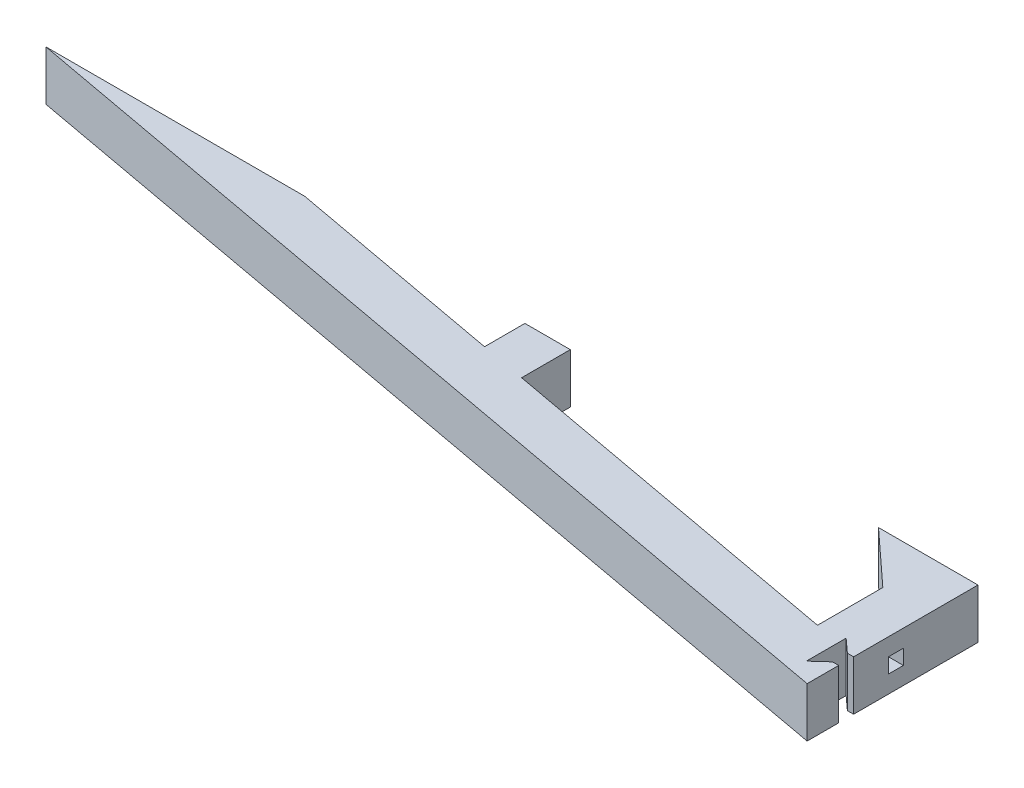
ISO-10303-21;
HEADER;
FILE_DESCRIPTION(('STEP AP214'),'2;1');
FILE_NAME('part.step','',(''),(''),'','','');
FILE_SCHEMA(('AUTOMOTIVE_DESIGN { 1 0 10303 214 1 1 1 1 }'));
ENDSEC;
DATA;
#1=APPLICATION_CONTEXT('core data for automotive mechanical design processes');
#2=APPLICATION_PROTOCOL_DEFINITION('international standard','automotive_design',2000,#1);
#3=PRODUCT_CONTEXT('',#1,'mechanical');
#4=PRODUCT('Part','Part','',(#3));
#5=PRODUCT_RELATED_PRODUCT_CATEGORY('part','',(#4));
#6=PRODUCT_DEFINITION_FORMATION('','',#4);
#7=PRODUCT_DEFINITION_CONTEXT('part definition',#1,'design');
#8=PRODUCT_DEFINITION('design','',#6,#7);
#9=PRODUCT_DEFINITION_SHAPE('','',#8);
#10=(LENGTH_UNIT() NAMED_UNIT(*) SI_UNIT(.MILLI.,.METRE.));
#11=(NAMED_UNIT(*) PLANE_ANGLE_UNIT() SI_UNIT($,.RADIAN.));
#12=(NAMED_UNIT(*) SI_UNIT($,.STERADIAN.) SOLID_ANGLE_UNIT());
#13=UNCERTAINTY_MEASURE_WITH_UNIT(LENGTH_MEASURE(1.E-05),#10,'distance_accuracy_value','');
#14=(GEOMETRIC_REPRESENTATION_CONTEXT(3) GLOBAL_UNCERTAINTY_ASSIGNED_CONTEXT((#13)) GLOBAL_UNIT_ASSIGNED_CONTEXT((#10,
#11,#12)) REPRESENTATION_CONTEXT('',''));
#15=CARTESIAN_POINT('',(0.,0.,0.));
#16=DIRECTION('',(0.,0.,1.));
#17=DIRECTION('',(1.,0.,0.));
#18=AXIS2_PLACEMENT_3D('',#15,#16,#17);
#19=CARTESIAN_POINT('',(0.,8.,0.));
#20=DIRECTION('',(-1.,0.,0.));
#21=DIRECTION('',(0.,0.,1.));
#22=AXIS2_PLACEMENT_3D('',#19,#20,#21);
#23=PLANE('',#22);
#24=DIRECTION('',(0.,0.,-1.));
#25=VECTOR('',#24,1.);
#26=CARTESIAN_POINT('',(0.,0.,0.));
#27=LINE('',#26,#25);
#28=CARTESIAN_POINT('',(0.,0.,27.47211487));
#29=VERTEX_POINT('',#28);
#30=CARTESIAN_POINT('',(0.,0.,22.4));
#31=VERTEX_POINT('',#30);
#32=EDGE_CURVE('E273',#29,#31,#27,.T.);
#33=ORIENTED_EDGE('',*,*,#32,.T.);
#34=DIRECTION('',(0.,1.,0.));
#35=VECTOR('',#34,1.);
#36=CARTESIAN_POINT('',(0.,0.,22.4));
#37=LINE('',#36,#35);
#38=CARTESIAN_POINT('',(0.,8.,22.4));
#39=VERTEX_POINT('',#38);
#40=EDGE_CURVE('E256',#31,#39,#37,.T.);
#41=ORIENTED_EDGE('',*,*,#40,.T.);
#42=DIRECTION('',(0.,0.,-1.));
#43=VECTOR('',#42,1.);
#44=CARTESIAN_POINT('',(0.,8.,0.));
#45=LINE('',#44,#43);
#46=CARTESIAN_POINT('',(0.,8.,27.47211487));
#47=VERTEX_POINT('',#46);
#48=EDGE_CURVE('E290',#47,#39,#45,.T.);
#49=ORIENTED_EDGE('',*,*,#48,.F.);
#50=DIRECTION('',(0.,-1.,0.));
#51=VECTOR('',#50,1.);
#52=CARTESIAN_POINT('',(0.,8.,27.47211487));
#53=LINE('',#52,#51);
#54=EDGE_CURVE('E317',#47,#29,#53,.T.);
#55=ORIENTED_EDGE('',*,*,#54,.T.);
#56=EDGE_LOOP('',(#33,#41,#49,#55));
#57=FACE_BOUND('',#56,.T.);
#58=ADVANCED_FACE('F32',(#57),#23,.F.);
#59=CARTESIAN_POINT('',(-7.3,8.,0.));
#60=DIRECTION('',(0.,0.,1.));
#61=DIRECTION('',(1.,0.,0.));
#62=AXIS2_PLACEMENT_3D('',#59,#60,#61);
#63=PLANE('',#62);
#64=CARTESIAN_POINT('',(-3.65,4.,0.));
#65=DIRECTION('',(0.,0.,-1.));
#66=DIRECTION('',(-1.,0.,0.));
#67=AXIS2_PLACEMENT_3D('',#64,#65,#66);
#68=CIRCLE('',#67,2.2);
#69=CARTESIAN_POINT('',(-5.85,4.,0.));
#70=VERTEX_POINT('',#69);
#71=EDGE_CURVE('E642',#70,#70,#68,.T.);
#72=ORIENTED_EDGE('',*,*,#71,.F.);
#73=EDGE_LOOP('',(#72));
#74=FACE_BOUND('',#73,.T.);
#75=DIRECTION('',(-1.,0.,0.));
#76=VECTOR('',#75,1.);
#77=CARTESIAN_POINT('',(-7.3,0.,0.));
#78=LINE('',#77,#76);
#79=CARTESIAN_POINT('',(0.,0.,0.));
#80=VERTEX_POINT('',#79);
#81=CARTESIAN_POINT('',(-16.,0.,0.));
#82=VERTEX_POINT('',#81);
#83=EDGE_CURVE('E259',#80,#82,#78,.T.);
#84=ORIENTED_EDGE('',*,*,#83,.T.);
#85=DIRECTION('',(0.,1.,0.));
#86=VECTOR('',#85,1.);
#87=CARTESIAN_POINT('',(-16.,0.,0.));
#88=LINE('',#87,#86);
#89=CARTESIAN_POINT('',(-16.,8.,0.));
#90=VERTEX_POINT('',#89);
#91=EDGE_CURVE('E221',#82,#90,#88,.T.);
#92=ORIENTED_EDGE('',*,*,#91,.T.);
#93=DIRECTION('',(-1.,0.,0.));
#94=VECTOR('',#93,1.);
#95=CARTESIAN_POINT('',(-7.3,8.,0.));
#96=LINE('',#95,#94);
#97=CARTESIAN_POINT('',(0.,8.,0.));
#98=VERTEX_POINT('',#97);
#99=EDGE_CURVE('E269',#98,#90,#96,.T.);
#100=ORIENTED_EDGE('',*,*,#99,.F.);
#101=DIRECTION('',(0.,-1.,0.));
#102=VECTOR('',#101,1.);
#103=CARTESIAN_POINT('',(0.,8.,0.));
#104=LINE('',#103,#102);
#105=EDGE_CURVE('E293',#98,#80,#104,.T.);
#106=ORIENTED_EDGE('',*,*,#105,.T.);
#107=EDGE_LOOP('',(#84,#92,#100,#106));
#108=FACE_BOUND('',#107,.T.);
#109=ADVANCED_FACE('F34',(#74,#108),#63,.F.);
#110=CARTESIAN_POINT('',(-7.3,8.,18.5087593431004));
#111=DIRECTION('',(1.,0.,0.));
#112=DIRECTION('',(0.,0.,-1.));
#113=AXIS2_PLACEMENT_3D('',#110,#111,#112);
#114=PLANE('',#113);
#115=DIRECTION('',(0.,0.,1.));
#116=VECTOR('',#115,1.);
#117=CARTESIAN_POINT('',(-7.3,8.,18.5087593431004));
#118=LINE('',#117,#116);
#119=CARTESIAN_POINT('',(-7.3,8.,8.));
#120=VERTEX_POINT('',#119);
#121=CARTESIAN_POINT('',(-7.3,8.,18.5087593431004));
#122=VERTEX_POINT('',#121);
#123=EDGE_CURVE('E272',#120,#122,#118,.T.);
#124=ORIENTED_EDGE('',*,*,#123,.F.);
#125=DIRECTION('',(0.,-1.,0.));
#126=VECTOR('',#125,1.);
#127=CARTESIAN_POINT('',(-7.3,8.,8.));
#128=LINE('',#127,#126);
#129=CARTESIAN_POINT('',(-7.3,0.,8.));
#130=VERTEX_POINT('',#129);
#131=EDGE_CURVE('E225',#120,#130,#128,.T.);
#132=ORIENTED_EDGE('',*,*,#131,.T.);
#133=DIRECTION('',(0.,0.,1.));
#134=VECTOR('',#133,1.);
#135=CARTESIAN_POINT('',(-7.3,0.,18.5087593431004));
#136=LINE('',#135,#134);
#137=CARTESIAN_POINT('',(-7.3,0.,18.5087593431004));
#138=VERTEX_POINT('',#137);
#139=EDGE_CURVE('E296',#130,#138,#136,.T.);
#140=ORIENTED_EDGE('',*,*,#139,.T.);
#141=DIRECTION('',(0.,-1.,0.));
#142=VECTOR('',#141,1.);
#143=CARTESIAN_POINT('',(-7.3,8.,18.5087593431004));
#144=LINE('',#143,#142);
#145=EDGE_CURVE('E11',#122,#138,#144,.T.);
#146=ORIENTED_EDGE('',*,*,#145,.F.);
#147=EDGE_LOOP('',(#124,#132,#140,#146));
#148=FACE_BOUND('',#147,.T.);
#149=ADVANCED_FACE('F367',(#148),#114,.F.);
#150=CARTESIAN_POINT('',(-65.55,8.,7.82944326528233));
#151=DIRECTION('',(-0.180330309758334,0.,0.983606109874508));
#152=DIRECTION('',(0.983606109874508,0.,0.180330309758334));
#153=AXIS2_PLACEMENT_3D('',#150,#151,#152);
#154=PLANE('',#153);
#155=DIRECTION('',(-0.983606109874508,0.,-0.180330309758334));
#156=VECTOR('',#155,1.);
#157=CARTESIAN_POINT('',(-65.55,0.,7.82944326528233));
#158=LINE('',#157,#156);
#159=CARTESIAN_POINT('',(-65.55,0.,7.82944326528233));
#160=VERTEX_POINT('',#159);
#161=EDGE_CURVE('E298',#138,#160,#158,.T.);
#162=ORIENTED_EDGE('',*,*,#161,.T.);
#163=DIRECTION('',(0.,-1.,0.));
#164=VECTOR('',#163,1.);
#165=CARTESIAN_POINT('',(-65.55,8.,7.82944326528233));
#166=LINE('',#165,#164);
#167=CARTESIAN_POINT('',(-65.55,8.,7.82944326528233));
#168=VERTEX_POINT('',#167);
#169=EDGE_CURVE('E40',#168,#160,#166,.T.);
#170=ORIENTED_EDGE('',*,*,#169,.F.);
#171=DIRECTION('',(-0.983606109874508,0.,-0.180330309758334));
#172=VECTOR('',#171,1.);
#173=CARTESIAN_POINT('',(-65.55,8.,7.82944326528233));
#174=LINE('',#173,#172);
#175=EDGE_CURVE('E275',#122,#168,#174,.T.);
#176=ORIENTED_EDGE('',*,*,#175,.F.);
#177=ORIENTED_EDGE('',*,*,#145,.T.);
#178=EDGE_LOOP('',(#162,#170,#176,#177));
#179=FACE_BOUND('',#178,.T.);
#180=ADVANCED_FACE('F365',(#179),#154,.F.);
#181=CARTESIAN_POINT('',(-65.55,8.,7.82944326528233));
#182=DIRECTION('',(-1.,0.,0.));
#183=DIRECTION('',(0.,0.,1.));
#184=AXIS2_PLACEMENT_3D('',#181,#182,#183);
#185=PLANE('',#184);
#186=DIRECTION('',(0.,0.,-1.));
#187=VECTOR('',#186,1.);
#188=CARTESIAN_POINT('',(-65.55,0.,7.82944326528233));
#189=LINE('',#188,#187);
#190=CARTESIAN_POINT('',(-65.55,0.,0.));
#191=VERTEX_POINT('',#190);
#192=EDGE_CURVE('E300',#160,#191,#189,.T.);
#193=ORIENTED_EDGE('',*,*,#192,.T.);
#194=DIRECTION('',(0.,-1.,0.));
#195=VECTOR('',#194,1.);
#196=CARTESIAN_POINT('',(-65.55,8.,0.));
#197=LINE('',#196,#195);
#198=CARTESIAN_POINT('',(-65.55,8.,0.));
#199=VERTEX_POINT('',#198);
#200=EDGE_CURVE('E332',#199,#191,#197,.T.);
#201=ORIENTED_EDGE('',*,*,#200,.F.);
#202=DIRECTION('',(0.,0.,-1.));
#203=VECTOR('',#202,1.);
#204=CARTESIAN_POINT('',(-65.55,8.,7.82944326528233));
#205=LINE('',#204,#203);
#206=EDGE_CURVE('E277',#168,#199,#205,.T.);
#207=ORIENTED_EDGE('',*,*,#206,.F.);
#208=ORIENTED_EDGE('',*,*,#169,.T.);
#209=EDGE_LOOP('',(#193,#201,#207,#208));
#210=FACE_BOUND('',#209,.T.);
#211=ADVANCED_FACE('F339',(#210),#185,.F.);
#212=CARTESIAN_POINT('',(-65.55,8.,0.));
#213=DIRECTION('',(0.,0.,1.));
#214=DIRECTION('',(1.,0.,0.));
#215=AXIS2_PLACEMENT_3D('',#212,#213,#214);
#216=PLANE('',#215);
#217=CARTESIAN_POINT('',(-69.2,4.,0.));
#218=DIRECTION('',(0.,0.,-1.));
#219=DIRECTION('',(-1.,0.,0.));
#220=AXIS2_PLACEMENT_3D('',#217,#218,#219);
#221=CIRCLE('',#220,2.2);
#222=CARTESIAN_POINT('',(-71.4,4.,0.));
#223=VERTEX_POINT('',#222);
#224=EDGE_CURVE('E201',#223,#223,#221,.T.);
#225=ORIENTED_EDGE('',*,*,#224,.F.);
#226=EDGE_LOOP('',(#225));
#227=FACE_BOUND('',#226,.T.);
#228=DIRECTION('',(-1.,0.,0.));
#229=VECTOR('',#228,1.);
#230=CARTESIAN_POINT('',(-65.55,0.,0.));
#231=LINE('',#230,#229);
#232=CARTESIAN_POINT('',(-72.85,0.,0.));
#233=VERTEX_POINT('',#232);
#234=EDGE_CURVE('E302',#191,#233,#231,.T.);
#235=ORIENTED_EDGE('',*,*,#234,.T.);
#236=DIRECTION('',(0.,-1.,0.));
#237=VECTOR('',#236,1.);
#238=CARTESIAN_POINT('',(-72.85,8.,0.));
#239=LINE('',#238,#237);
#240=CARTESIAN_POINT('',(-72.85,8.,0.));
#241=VERTEX_POINT('',#240);
#242=EDGE_CURVE('E329',#241,#233,#239,.T.);
#243=ORIENTED_EDGE('',*,*,#242,.F.);
#244=DIRECTION('',(-1.,0.,0.));
#245=VECTOR('',#244,1.);
#246=CARTESIAN_POINT('',(-65.55,8.,0.));
#247=LINE('',#246,#245);
#248=EDGE_CURVE('E279',#199,#241,#247,.T.);
#249=ORIENTED_EDGE('',*,*,#248,.F.);
#250=ORIENTED_EDGE('',*,*,#200,.T.);
#251=EDGE_LOOP('',(#235,#243,#249,#250));
#252=FACE_BOUND('',#251,.T.);
#253=ADVANCED_FACE('F353',(#227,#252),#216,.F.);
#254=CARTESIAN_POINT('',(-72.85,8.,0.));
#255=DIRECTION('',(1.,0.,0.));
#256=DIRECTION('',(0.,0.,-1.));
#257=AXIS2_PLACEMENT_3D('',#254,#255,#256);
#258=PLANE('',#257);
#259=DIRECTION('',(0.,0.,1.));
#260=VECTOR('',#259,1.);
#261=CARTESIAN_POINT('',(-72.85,0.,0.));
#262=LINE('',#261,#260);
#263=CARTESIAN_POINT('',(-72.85,0.,6.49109120746135));
#264=VERTEX_POINT('',#263);
#265=EDGE_CURVE('E304',#233,#264,#262,.T.);
#266=ORIENTED_EDGE('',*,*,#265,.T.);
#267=DIRECTION('',(0.,-1.,0.));
#268=VECTOR('',#267,1.);
#269=CARTESIAN_POINT('',(-72.85,8.,6.49109120746135));
#270=LINE('',#269,#268);
#271=CARTESIAN_POINT('',(-72.85,8.,6.49109120746135));
#272=VERTEX_POINT('',#271);
#273=EDGE_CURVE('E326',#272,#264,#270,.T.);
#274=ORIENTED_EDGE('',*,*,#273,.F.);
#275=DIRECTION('',(0.,0.,1.));
#276=VECTOR('',#275,1.);
#277=CARTESIAN_POINT('',(-72.85,8.,0.));
#278=LINE('',#277,#276);
#279=EDGE_CURVE('E281',#241,#272,#278,.T.);
#280=ORIENTED_EDGE('',*,*,#279,.F.);
#281=ORIENTED_EDGE('',*,*,#242,.T.);
#282=EDGE_LOOP('',(#266,#274,#280,#281));
#283=FACE_BOUND('',#282,.T.);
#284=ADVANCED_FACE('F357',(#283),#258,.F.);
#285=CARTESIAN_POINT('',(-72.85,8.,6.49109120746135));
#286=DIRECTION('',(-0.180330309758334,0.,0.983606109874508));
#287=DIRECTION('',(0.983606109874508,0.,0.180330309758334));
#288=AXIS2_PLACEMENT_3D('',#285,#286,#287);
#289=PLANE('',#288);
#290=DIRECTION('',(-0.983606109874508,0.,-0.180330309758334));
#291=VECTOR('',#290,1.);
#292=CARTESIAN_POINT('',(-72.85,0.,6.49109120746135));
#293=LINE('',#292,#291);
#294=CARTESIAN_POINT('',(-108.259653873212,0.,-0.000769494996487487));
#295=VERTEX_POINT('',#294);
#296=EDGE_CURVE('E306',#264,#295,#293,.T.);
#297=ORIENTED_EDGE('',*,*,#296,.T.);
#298=DIRECTION('',(0.,-1.,0.));
#299=VECTOR('',#298,1.);
#300=CARTESIAN_POINT('',(-108.259653873212,8.,-0.000769494996487487));
#301=LINE('',#300,#299);
#302=CARTESIAN_POINT('',(-108.259653873212,8.,-0.000769494996487487));
#303=VERTEX_POINT('',#302);
#304=EDGE_CURVE('E323',#303,#295,#301,.T.);
#305=ORIENTED_EDGE('',*,*,#304,.F.);
#306=DIRECTION('',(-0.983606109874508,0.,-0.180330309758334));
#307=VECTOR('',#306,1.);
#308=CARTESIAN_POINT('',(-72.85,8.,6.49109120746135));
#309=LINE('',#308,#307);
#310=EDGE_CURVE('E283',#272,#303,#309,.T.);
#311=ORIENTED_EDGE('',*,*,#310,.F.);
#312=ORIENTED_EDGE('',*,*,#273,.T.);
#313=EDGE_LOOP('',(#297,#305,#311,#312));
#314=FACE_BOUND('',#313,.T.);
#315=ADVANCED_FACE('F409',(#314),#289,.F.);
#316=CARTESIAN_POINT('',(-108.259653873212,8.,-0.000769494996487487));
#317=DIRECTION('',(0.,0.,1.));
#318=DIRECTION('',(1.,0.,0.));
#319=AXIS2_PLACEMENT_3D('',#316,#317,#318);
#320=PLANE('',#319);
#321=DIRECTION('',(-1.,0.,0.));
#322=VECTOR('',#321,1.);
#323=CARTESIAN_POINT('',(-108.259653873212,0.,-0.000769494996487487));
#324=LINE('',#323,#322);
#325=CARTESIAN_POINT('',(-149.85,0.,-0.000769494996482462));
#326=VERTEX_POINT('',#325);
#327=EDGE_CURVE('E308',#295,#326,#324,.T.);
#328=ORIENTED_EDGE('',*,*,#327,.T.);
#329=DIRECTION('',(0.,-1.,0.));
#330=VECTOR('',#329,1.);
#331=CARTESIAN_POINT('',(-149.85,8.,-0.000769494996482462));
#332=LINE('',#331,#330);
#333=CARTESIAN_POINT('',(-149.85,8.,-0.000769494996482462));
#334=VERTEX_POINT('',#333);
#335=EDGE_CURVE('E320',#334,#326,#332,.T.);
#336=ORIENTED_EDGE('',*,*,#335,.F.);
#337=DIRECTION('',(-1.,0.,0.));
#338=VECTOR('',#337,1.);
#339=CARTESIAN_POINT('',(-108.259653873212,8.,-0.000769494996487487));
#340=LINE('',#339,#338);
#341=EDGE_CURVE('E285',#303,#334,#340,.T.);
#342=ORIENTED_EDGE('',*,*,#341,.F.);
#343=ORIENTED_EDGE('',*,*,#304,.T.);
#344=EDGE_LOOP('',(#328,#336,#342,#343));
#345=FACE_BOUND('',#344,.T.);
#346=ADVANCED_FACE('F407',(#345),#320,.F.);
#347=CARTESIAN_POINT('',(0.,8.,27.47211487));
#348=DIRECTION('',(0.180330309758334,0.,-0.983606109874508));
#349=DIRECTION('',(-0.983606109874508,0.,-0.180330309758334));
#350=AXIS2_PLACEMENT_3D('',#347,#348,#349);
#351=PLANE('',#350);
#352=DIRECTION('',(0.983606109874508,0.,0.180330309758334));
#353=VECTOR('',#352,1.);
#354=CARTESIAN_POINT('',(0.,0.,27.47211487));
#355=LINE('',#354,#353);
#356=EDGE_CURVE('E310',#326,#29,#355,.T.);
#357=ORIENTED_EDGE('',*,*,#356,.T.);
#358=ORIENTED_EDGE('',*,*,#54,.F.);
#359=DIRECTION('',(0.983606109874508,0.,0.180330309758334));
#360=VECTOR('',#359,1.);
#361=CARTESIAN_POINT('',(0.,8.,27.47211487));
#362=LINE('',#361,#360);
#363=EDGE_CURVE('E287',#334,#47,#362,.T.);
#364=ORIENTED_EDGE('',*,*,#363,.F.);
#365=ORIENTED_EDGE('',*,*,#335,.T.);
#366=EDGE_LOOP('',(#357,#358,#364,#365));
#367=FACE_BOUND('',#366,.T.);
#368=ADVANCED_FACE('F403',(#367),#351,.F.);
#369=DIRECTION('',(0.,0.,-1.));
#370=VECTOR('',#369,1.);
#371=CARTESIAN_POINT('',(0.,2.8,14.4));
#372=LINE('',#371,#370);
#373=CARTESIAN_POINT('',(0.,2.8,14.4));
#374=VERTEX_POINT('',#373);
#375=CARTESIAN_POINT('',(0.,2.8,12.));
#376=VERTEX_POINT('',#375);
#377=EDGE_CURVE('E207',#374,#376,#372,.T.);
#378=ORIENTED_EDGE('',*,*,#377,.F.);
#379=DIRECTION('',(0.,-1.,0.));
#380=VECTOR('',#379,1.);
#381=CARTESIAN_POINT('',(0.,5.2,14.4));
#382=LINE('',#381,#380);
#383=CARTESIAN_POINT('',(0.,5.2,14.4));
#384=VERTEX_POINT('',#383);
#385=EDGE_CURVE('E47',#384,#374,#382,.T.);
#386=ORIENTED_EDGE('',*,*,#385,.F.);
#387=DIRECTION('',(0.,0.,1.));
#388=VECTOR('',#387,1.);
#389=CARTESIAN_POINT('',(0.,5.2,14.4));
#390=LINE('',#389,#388);
#391=CARTESIAN_POINT('',(0.,5.2,12.));
#392=VERTEX_POINT('',#391);
#393=EDGE_CURVE('E195',#392,#384,#390,.T.);
#394=ORIENTED_EDGE('',*,*,#393,.F.);
#395=DIRECTION('',(0.,1.,0.));
#396=VECTOR('',#395,1.);
#397=CARTESIAN_POINT('',(0.,5.2,12.));
#398=LINE('',#397,#396);
#399=EDGE_CURVE('E198',#376,#392,#398,.T.);
#400=ORIENTED_EDGE('',*,*,#399,.F.);
#401=EDGE_LOOP('',(#378,#386,#394,#400));
#402=FACE_BOUND('',#401,.T.);
#403=CARTESIAN_POINT('',(0.,0.,20.));
#404=VERTEX_POINT('',#403);
#405=EDGE_CURVE('E312',#404,#80,#27,.T.);
#406=ORIENTED_EDGE('',*,*,#405,.T.);
#407=ORIENTED_EDGE('',*,*,#105,.F.);
#408=CARTESIAN_POINT('',(0.,8.,20.));
#409=VERTEX_POINT('',#408);
#410=EDGE_CURVE('E289',#409,#98,#45,.T.);
#411=ORIENTED_EDGE('',*,*,#410,.F.);
#412=DIRECTION('',(0.,1.,0.));
#413=VECTOR('',#412,1.);
#414=CARTESIAN_POINT('',(0.,0.,20.));
#415=LINE('',#414,#413);
#416=EDGE_CURVE('E243',#404,#409,#415,.T.);
#417=ORIENTED_EDGE('',*,*,#416,.F.);
#418=EDGE_LOOP('',(#406,#407,#411,#417));
#419=FACE_BOUND('',#418,.T.);
#420=ADVANCED_FACE('F376',(#402,#419),#23,.F.);
#421=CARTESIAN_POINT('',(0.,8.,0.));
#422=DIRECTION('',(0.,-1.,0.));
#423=DIRECTION('',(0.,0.,-1.));
#424=AXIS2_PLACEMENT_3D('',#421,#422,#423);
#425=PLANE('',#424);
#426=ORIENTED_EDGE('',*,*,#99,.T.);
#427=DIRECTION('',(0.736099620693866,0.,0.676873214431141));
#428=VECTOR('',#427,1.);
#429=CARTESIAN_POINT('',(-16.,8.,0.));
#430=LINE('',#429,#428);
#431=EDGE_CURVE('E218',#90,#120,#430,.T.);
#432=ORIENTED_EDGE('',*,*,#431,.T.);
#433=ORIENTED_EDGE('',*,*,#123,.T.);
#434=ORIENTED_EDGE('',*,*,#175,.T.);
#435=ORIENTED_EDGE('',*,*,#206,.T.);
#436=ORIENTED_EDGE('',*,*,#248,.T.);
#437=ORIENTED_EDGE('',*,*,#279,.T.);
#438=ORIENTED_EDGE('',*,*,#310,.T.);
#439=ORIENTED_EDGE('',*,*,#341,.T.);
#440=ORIENTED_EDGE('',*,*,#363,.T.);
#441=ORIENTED_EDGE('',*,*,#48,.T.);
#442=DIRECTION('',(1.,0.,0.));
#443=VECTOR('',#442,1.);
#444=CARTESIAN_POINT('',(-0.999999999999996,8.,22.4));
#445=LINE('',#444,#443);
#446=CARTESIAN_POINT('',(-0.999999999999996,8.,22.4));
#447=VERTEX_POINT('',#446);
#448=EDGE_CURVE('E232',#447,#39,#445,.T.);
#449=ORIENTED_EDGE('',*,*,#448,.F.);
#450=DIRECTION('',(0.739940073395943,0.,-0.672672793996313));
#451=VECTOR('',#450,1.);
#452=CARTESIAN_POINT('',(-3.2,8.,24.4));
#453=LINE('',#452,#451);
#454=CARTESIAN_POINT('',(-3.2,8.,24.4));
#455=VERTEX_POINT('',#454);
#456=EDGE_CURVE('E252',#455,#447,#453,.T.);
#457=ORIENTED_EDGE('',*,*,#456,.F.);
#458=DIRECTION('',(0.,0.,1.));
#459=VECTOR('',#458,1.);
#460=CARTESIAN_POINT('',(-3.2,8.,18.));
#461=LINE('',#460,#459);
#462=CARTESIAN_POINT('',(-3.2,8.,18.));
#463=VERTEX_POINT('',#462);
#464=EDGE_CURVE('E249',#463,#455,#461,.T.);
#465=ORIENTED_EDGE('',*,*,#464,.F.);
#466=DIRECTION('',(-0.739940073395941,0.,-0.672672793996315));
#467=VECTOR('',#466,1.);
#468=CARTESIAN_POINT('',(-1.00000000000001,8.,20.));
#469=LINE('',#468,#467);
#470=CARTESIAN_POINT('',(-1.00000000000001,8.,20.));
#471=VERTEX_POINT('',#470);
#472=EDGE_CURVE('E246',#471,#463,#469,.T.);
#473=ORIENTED_EDGE('',*,*,#472,.F.);
#474=DIRECTION('',(-1.,0.,0.));
#475=VECTOR('',#474,1.);
#476=CARTESIAN_POINT('',(0.,8.,20.));
#477=LINE('',#476,#475);
#478=EDGE_CURVE('E228',#409,#471,#477,.T.);
#479=ORIENTED_EDGE('',*,*,#478,.F.);
#480=ORIENTED_EDGE('',*,*,#410,.T.);
#481=EDGE_LOOP('',(#426,#432,#433,#434,#435,#436,#437,#438,#439,#440,#441,#449,#457,#465,#473,
#479,#480));
#482=FACE_BOUND('',#481,.T.);
#483=ADVANCED_FACE('F361',(#482),#425,.F.);
#484=CARTESIAN_POINT('',(0.,0.,0.));
#485=DIRECTION('',(0.,-1.,0.));
#486=DIRECTION('',(0.,0.,-1.));
#487=AXIS2_PLACEMENT_3D('',#484,#485,#486);
#488=PLANE('',#487);
#489=DIRECTION('',(0.736099620693866,0.,0.676873214431141));
#490=VECTOR('',#489,1.);
#491=CARTESIAN_POINT('',(-16.,0.,0.));
#492=LINE('',#491,#490);
#493=EDGE_CURVE('E214',#82,#130,#492,.T.);
#494=ORIENTED_EDGE('',*,*,#493,.F.);
#495=ORIENTED_EDGE('',*,*,#83,.F.);
#496=ORIENTED_EDGE('',*,*,#405,.F.);
#497=DIRECTION('',(-1.,0.,0.));
#498=VECTOR('',#497,1.);
#499=CARTESIAN_POINT('',(0.,0.,20.));
#500=LINE('',#499,#498);
#501=CARTESIAN_POINT('',(-1.00000000000001,0.,20.));
#502=VERTEX_POINT('',#501);
#503=EDGE_CURVE('E229',#404,#502,#500,.T.);
#504=ORIENTED_EDGE('',*,*,#503,.T.);
#505=DIRECTION('',(-0.739940073395941,0.,-0.672672793996315));
#506=VECTOR('',#505,1.);
#507=CARTESIAN_POINT('',(-1.00000000000001,0.,20.));
#508=LINE('',#507,#506);
#509=CARTESIAN_POINT('',(-3.2,0.,18.));
#510=VERTEX_POINT('',#509);
#511=EDGE_CURVE('E55',#502,#510,#508,.T.);
#512=ORIENTED_EDGE('',*,*,#511,.T.);
#513=DIRECTION('',(0.,0.,1.));
#514=VECTOR('',#513,1.);
#515=CARTESIAN_POINT('',(-3.2,0.,18.));
#516=LINE('',#515,#514);
#517=CARTESIAN_POINT('',(-3.2,0.,24.4));
#518=VERTEX_POINT('',#517);
#519=EDGE_CURVE('E234',#510,#518,#516,.T.);
#520=ORIENTED_EDGE('',*,*,#519,.T.);
#521=DIRECTION('',(0.739940073395943,0.,-0.672672793996313));
#522=VECTOR('',#521,1.);
#523=CARTESIAN_POINT('',(-3.2,0.,24.4));
#524=LINE('',#523,#522);
#525=CARTESIAN_POINT('',(-0.999999999999996,0.,22.4));
#526=VERTEX_POINT('',#525);
#527=EDGE_CURVE('E237',#518,#526,#524,.T.);
#528=ORIENTED_EDGE('',*,*,#527,.T.);
#529=DIRECTION('',(1.,0.,0.));
#530=VECTOR('',#529,1.);
#531=CARTESIAN_POINT('',(-0.999999999999996,0.,22.4));
#532=LINE('',#531,#530);
#533=EDGE_CURVE('E240',#526,#31,#532,.T.);
#534=ORIENTED_EDGE('',*,*,#533,.T.);
#535=ORIENTED_EDGE('',*,*,#32,.F.);
#536=ORIENTED_EDGE('',*,*,#356,.F.);
#537=ORIENTED_EDGE('',*,*,#327,.F.);
#538=ORIENTED_EDGE('',*,*,#296,.F.);
#539=ORIENTED_EDGE('',*,*,#265,.F.);
#540=ORIENTED_EDGE('',*,*,#234,.F.);
#541=ORIENTED_EDGE('',*,*,#192,.F.);
#542=ORIENTED_EDGE('',*,*,#161,.F.);
#543=ORIENTED_EDGE('',*,*,#139,.F.);
#544=EDGE_LOOP('',(#494,#495,#496,#504,#512,#520,#528,#534,#535,#536,#537,#538,#539,#540,#541,
#542,#543));
#545=FACE_BOUND('',#544,.T.);
#546=ADVANCED_FACE('F347',(#545),#488,.T.);
#547=CARTESIAN_POINT('',(-0.999999999999996,0.,22.4));
#548=DIRECTION('',(0.,0.,1.));
#549=DIRECTION('',(1.,0.,0.));
#550=AXIS2_PLACEMENT_3D('',#547,#548,#549);
#551=PLANE('',#550);
#552=ORIENTED_EDGE('',*,*,#448,.T.);
#553=ORIENTED_EDGE('',*,*,#40,.F.);
#554=ORIENTED_EDGE('',*,*,#533,.F.);
#555=DIRECTION('',(0.,1.,0.));
#556=VECTOR('',#555,1.);
#557=CARTESIAN_POINT('',(-0.999999999999996,0.,22.4));
#558=LINE('',#557,#556);
#559=EDGE_CURVE('E260',#526,#447,#558,.T.);
#560=ORIENTED_EDGE('',*,*,#559,.T.);
#561=EDGE_LOOP('',(#552,#553,#554,#560));
#562=FACE_BOUND('',#561,.T.);
#563=ADVANCED_FACE('F395',(#562),#551,.F.);
#564=CARTESIAN_POINT('',(-3.2,0.,24.4));
#565=DIRECTION('',(0.672672793996313,0.,0.739940073395943));
#566=DIRECTION('',(0.739940073395943,0.,-0.672672793996313));
#567=AXIS2_PLACEMENT_3D('',#564,#565,#566);
#568=PLANE('',#567);
#569=ORIENTED_EDGE('',*,*,#456,.T.);
#570=ORIENTED_EDGE('',*,*,#559,.F.);
#571=ORIENTED_EDGE('',*,*,#527,.F.);
#572=DIRECTION('',(0.,1.,0.));
#573=VECTOR('',#572,1.);
#574=CARTESIAN_POINT('',(-3.2,0.,24.4));
#575=LINE('',#574,#573);
#576=EDGE_CURVE('E262',#518,#455,#575,.T.);
#577=ORIENTED_EDGE('',*,*,#576,.T.);
#578=EDGE_LOOP('',(#569,#570,#571,#577));
#579=FACE_BOUND('',#578,.T.);
#580=ADVANCED_FACE('F393',(#579),#568,.F.);
#581=CARTESIAN_POINT('',(-3.2,0.,18.));
#582=DIRECTION('',(-1.,0.,0.));
#583=DIRECTION('',(0.,0.,1.));
#584=AXIS2_PLACEMENT_3D('',#581,#582,#583);
#585=PLANE('',#584);
#586=ORIENTED_EDGE('',*,*,#464,.T.);
#587=ORIENTED_EDGE('',*,*,#576,.F.);
#588=ORIENTED_EDGE('',*,*,#519,.F.);
#589=DIRECTION('',(0.,1.,0.));
#590=VECTOR('',#589,1.);
#591=CARTESIAN_POINT('',(-3.2,0.,18.));
#592=LINE('',#591,#590);
#593=EDGE_CURVE('E264',#510,#463,#592,.T.);
#594=ORIENTED_EDGE('',*,*,#593,.T.);
#595=EDGE_LOOP('',(#586,#587,#588,#594));
#596=FACE_BOUND('',#595,.T.);
#597=ADVANCED_FACE('F388',(#596),#585,.F.);
#598=CARTESIAN_POINT('',(-1.00000000000001,0.,20.));
#599=DIRECTION('',(0.672672793996316,0.,-0.739940073395941));
#600=DIRECTION('',(-0.739940073395941,0.,-0.672672793996315));
#601=AXIS2_PLACEMENT_3D('',#598,#599,#600);
#602=PLANE('',#601);
#603=ORIENTED_EDGE('',*,*,#472,.T.);
#604=ORIENTED_EDGE('',*,*,#593,.F.);
#605=ORIENTED_EDGE('',*,*,#511,.F.);
#606=DIRECTION('',(0.,1.,0.));
#607=VECTOR('',#606,1.);
#608=CARTESIAN_POINT('',(-1.00000000000001,0.,20.));
#609=LINE('',#608,#607);
#610=EDGE_CURVE('E266',#502,#471,#609,.T.);
#611=ORIENTED_EDGE('',*,*,#610,.T.);
#612=EDGE_LOOP('',(#603,#604,#605,#611));
#613=FACE_BOUND('',#612,.T.);
#614=ADVANCED_FACE('F382',(#613),#602,.F.);
#615=CARTESIAN_POINT('',(0.,0.,20.));
#616=DIRECTION('',(0.,0.,-1.));
#617=DIRECTION('',(-1.,0.,0.));
#618=AXIS2_PLACEMENT_3D('',#615,#616,#617);
#619=PLANE('',#618);
#620=ORIENTED_EDGE('',*,*,#478,.T.);
#621=ORIENTED_EDGE('',*,*,#610,.F.);
#622=ORIENTED_EDGE('',*,*,#503,.F.);
#623=ORIENTED_EDGE('',*,*,#416,.T.);
#624=EDGE_LOOP('',(#620,#621,#622,#623));
#625=FACE_BOUND('',#624,.T.);
#626=ADVANCED_FACE('F379',(#625),#619,.F.);
#627=CARTESIAN_POINT('',(-16.,8.,0.));
#628=DIRECTION('',(0.676873214431141,0.,-0.736099620693866));
#629=DIRECTION('',(-0.736099620693866,0.,-0.676873214431141));
#630=AXIS2_PLACEMENT_3D('',#627,#628,#629);
#631=PLANE('',#630);
#632=ORIENTED_EDGE('',*,*,#493,.T.);
#633=ORIENTED_EDGE('',*,*,#131,.F.);
#634=ORIENTED_EDGE('',*,*,#431,.F.);
#635=ORIENTED_EDGE('',*,*,#91,.F.);
#636=EDGE_LOOP('',(#632,#633,#634,#635));
#637=FACE_BOUND('',#636,.T.);
#638=ADVANCED_FACE('F446',(#637),#631,.F.);
#639=CARTESIAN_POINT('',(-4.4,5.2,14.4));
#640=DIRECTION('',(0.,0.,1.));
#641=DIRECTION('',(1.,0.,0.));
#642=AXIS2_PLACEMENT_3D('',#639,#640,#641);
#643=PLANE('',#642);
#644=ORIENTED_EDGE('',*,*,#385,.T.);
#645=DIRECTION('',(1.,0.,0.));
#646=VECTOR('',#645,1.);
#647=CARTESIAN_POINT('',(-4.4,2.8,14.4));
#648=LINE('',#647,#646);
#649=CARTESIAN_POINT('',(-4.4,2.8,14.4));
#650=VERTEX_POINT('',#649);
#651=EDGE_CURVE('E173',#650,#374,#648,.T.);
#652=ORIENTED_EDGE('',*,*,#651,.F.);
#653=DIRECTION('',(0.,-1.,0.));
#654=VECTOR('',#653,1.);
#655=CARTESIAN_POINT('',(-4.4,5.2,14.4));
#656=LINE('',#655,#654);
#657=CARTESIAN_POINT('',(-4.4,5.2,14.4));
#658=VERTEX_POINT('',#657);
#659=EDGE_CURVE('E177',#658,#650,#656,.T.);
#660=ORIENTED_EDGE('',*,*,#659,.F.);
#661=DIRECTION('',(1.,0.,0.));
#662=VECTOR('',#661,1.);
#663=CARTESIAN_POINT('',(-4.4,5.2,14.4));
#664=LINE('',#663,#662);
#665=EDGE_CURVE('E212',#658,#384,#664,.T.);
#666=ORIENTED_EDGE('',*,*,#665,.T.);
#667=EDGE_LOOP('',(#644,#652,#660,#666));
#668=FACE_BOUND('',#667,.T.);
#669=ADVANCED_FACE('F175',(#668),#643,.F.);
#670=CARTESIAN_POINT('',(-4.4,5.2,14.4));
#671=DIRECTION('',(0.,1.,0.));
#672=DIRECTION('',(0.,0.,1.));
#673=AXIS2_PLACEMENT_3D('',#670,#671,#672);
#674=PLANE('',#673);
#675=ORIENTED_EDGE('',*,*,#393,.T.);
#676=ORIENTED_EDGE('',*,*,#665,.F.);
#677=DIRECTION('',(0.,0.,1.));
#678=VECTOR('',#677,1.);
#679=CARTESIAN_POINT('',(-4.4,5.2,14.4));
#680=LINE('',#679,#678);
#681=CARTESIAN_POINT('',(-4.4,5.2,12.));
#682=VERTEX_POINT('',#681);
#683=EDGE_CURVE('E183',#682,#658,#680,.T.);
#684=ORIENTED_EDGE('',*,*,#683,.F.);
#685=DIRECTION('',(1.,0.,0.));
#686=VECTOR('',#685,1.);
#687=CARTESIAN_POINT('',(-4.4,5.2,12.));
#688=LINE('',#687,#686);
#689=EDGE_CURVE('E215',#682,#392,#688,.T.);
#690=ORIENTED_EDGE('',*,*,#689,.T.);
#691=EDGE_LOOP('',(#675,#676,#684,#690));
#692=FACE_BOUND('',#691,.T.);
#693=ADVANCED_FACE('F438',(#692),#674,.F.);
#694=CARTESIAN_POINT('',(-4.4,5.2,12.));
#695=DIRECTION('',(0.,0.,-1.));
#696=DIRECTION('',(-1.,0.,0.));
#697=AXIS2_PLACEMENT_3D('',#694,#695,#696);
#698=PLANE('',#697);
#699=ORIENTED_EDGE('',*,*,#399,.T.);
#700=ORIENTED_EDGE('',*,*,#689,.F.);
#701=DIRECTION('',(0.,1.,0.));
#702=VECTOR('',#701,1.);
#703=CARTESIAN_POINT('',(-4.4,5.2,12.));
#704=LINE('',#703,#702);
#705=CARTESIAN_POINT('',(-4.4,2.8,12.));
#706=VERTEX_POINT('',#705);
#707=EDGE_CURVE('E191',#706,#682,#704,.T.);
#708=ORIENTED_EDGE('',*,*,#707,.F.);
#709=DIRECTION('',(1.,0.,0.));
#710=VECTOR('',#709,1.);
#711=CARTESIAN_POINT('',(-4.4,2.8,12.));
#712=LINE('',#711,#710);
#713=EDGE_CURVE('E182',#706,#376,#712,.T.);
#714=ORIENTED_EDGE('',*,*,#713,.T.);
#715=EDGE_LOOP('',(#699,#700,#708,#714));
#716=FACE_BOUND('',#715,.T.);
#717=ADVANCED_FACE('F436',(#716),#698,.F.);
#718=CARTESIAN_POINT('',(-4.4,2.8,14.4));
#719=DIRECTION('',(0.,-1.,0.));
#720=DIRECTION('',(0.,0.,-1.));
#721=AXIS2_PLACEMENT_3D('',#718,#719,#720);
#722=PLANE('',#721);
#723=ORIENTED_EDGE('',*,*,#377,.T.);
#724=ORIENTED_EDGE('',*,*,#713,.F.);
#725=DIRECTION('',(0.,0.,-1.));
#726=VECTOR('',#725,1.);
#727=CARTESIAN_POINT('',(-4.4,2.8,14.4));
#728=LINE('',#727,#726);
#729=EDGE_CURVE('E186',#650,#706,#728,.T.);
#730=ORIENTED_EDGE('',*,*,#729,.F.);
#731=ORIENTED_EDGE('',*,*,#651,.T.);
#732=EDGE_LOOP('',(#723,#724,#730,#731));
#733=FACE_BOUND('',#732,.T.);
#734=ADVANCED_FACE('F187',(#733),#722,.F.);
#735=CARTESIAN_POINT('',(-4.4,0.,0.));
#736=DIRECTION('',(1.,0.,0.));
#737=DIRECTION('',(0.,0.,-1.));
#738=AXIS2_PLACEMENT_3D('',#735,#736,#737);
#739=PLANE('',#738);
#740=ORIENTED_EDGE('',*,*,#659,.T.);
#741=ORIENTED_EDGE('',*,*,#729,.T.);
#742=ORIENTED_EDGE('',*,*,#707,.T.);
#743=ORIENTED_EDGE('',*,*,#683,.T.);
#744=EDGE_LOOP('',(#740,#741,#742,#743));
#745=FACE_BOUND('',#744,.T.);
#746=ADVANCED_FACE('F193',(#745),#739,.T.);
#747=CARTESIAN_POINT('',(-69.2,4.,2.40000000000001));
#748=DIRECTION('',(0.,0.,-1.));
#749=DIRECTION('',(-1.,0.,0.));
#750=AXIS2_PLACEMENT_3D('',#747,#748,#749);
#751=CYLINDRICAL_SURFACE('',#750,2.2);
#752=CARTESIAN_POINT('',(-69.2,4.,2.40000000000001));
#753=DIRECTION('',(0.,0.,-1.));
#754=DIRECTION('',(-1.,0.,0.));
#755=AXIS2_PLACEMENT_3D('',#752,#753,#754);
#756=CIRCLE('',#755,2.2);
#757=CARTESIAN_POINT('',(-71.4,4.,2.40000000000001));
#758=VERTEX_POINT('',#757);
#759=EDGE_CURVE('E644',#758,#758,#756,.T.);
#760=ORIENTED_EDGE('',*,*,#759,.F.);
#761=EDGE_LOOP('',(#760));
#762=FACE_BOUND('',#761,.T.);
#763=ORIENTED_EDGE('',*,*,#224,.T.);
#764=EDGE_LOOP('',(#763));
#765=FACE_BOUND('',#764,.T.);
#766=ADVANCED_FACE('F525',(#762,#765),#751,.F.);
#767=CARTESIAN_POINT('',(-69.2,4.,2.40000000000001));
#768=DIRECTION('',(0.,0.,-1.));
#769=DIRECTION('',(-1.,0.,0.));
#770=AXIS2_PLACEMENT_3D('',#767,#768,#769);
#771=PLANE('',#770);
#772=CARTESIAN_POINT('',(-69.2,4.,2.40000000000001));
#773=DIRECTION('',(0.,0.,-1.));
#774=DIRECTION('',(-1.,0.,0.));
#775=AXIS2_PLACEMENT_3D('',#772,#773,#774);
#776=CIRCLE('',#775,1.85);
#777=CARTESIAN_POINT('',(-71.05,4.,2.40000000000001));
#778=VERTEX_POINT('',#777);
#779=EDGE_CURVE('E631',#778,#778,#776,.T.);
#780=ORIENTED_EDGE('',*,*,#779,.F.);
#781=EDGE_LOOP('',(#780));
#782=FACE_BOUND('',#781,.T.);
#783=ORIENTED_EDGE('',*,*,#759,.T.);
#784=EDGE_LOOP('',(#783));
#785=FACE_BOUND('',#784,.T.);
#786=ADVANCED_FACE('F554',(#782,#785),#771,.T.);
#787=CARTESIAN_POINT('',(-3.65,4.,2.4));
#788=DIRECTION('',(0.,0.,-1.));
#789=DIRECTION('',(-1.,0.,0.));
#790=AXIS2_PLACEMENT_3D('',#787,#788,#789);
#791=CYLINDRICAL_SURFACE('',#790,2.2);
#792=CARTESIAN_POINT('',(-3.65,4.,2.4));
#793=DIRECTION('',(0.,0.,-1.));
#794=DIRECTION('',(-1.,0.,0.));
#795=AXIS2_PLACEMENT_3D('',#792,#793,#794);
#796=CIRCLE('',#795,2.2);
#797=CARTESIAN_POINT('',(-5.85,4.,2.4));
#798=VERTEX_POINT('',#797);
#799=EDGE_CURVE('E208',#798,#798,#796,.T.);
#800=ORIENTED_EDGE('',*,*,#799,.F.);
#801=EDGE_LOOP('',(#800));
#802=FACE_BOUND('',#801,.T.);
#803=ORIENTED_EDGE('',*,*,#71,.T.);
#804=EDGE_LOOP('',(#803));
#805=FACE_BOUND('',#804,.T.);
#806=ADVANCED_FACE('F561',(#802,#805),#791,.F.);
#807=CARTESIAN_POINT('',(-3.65,4.,2.4));
#808=DIRECTION('',(0.,0.,-1.));
#809=DIRECTION('',(-1.,0.,0.));
#810=AXIS2_PLACEMENT_3D('',#807,#808,#809);
#811=PLANE('',#810);
#812=CARTESIAN_POINT('',(-3.65,4.,2.4));
#813=DIRECTION('',(0.,0.,-1.));
#814=DIRECTION('',(-1.,0.,0.));
#815=AXIS2_PLACEMENT_3D('',#812,#813,#814);
#816=CIRCLE('',#815,1.85);
#817=CARTESIAN_POINT('',(-5.5,4.,2.4));
#818=VERTEX_POINT('',#817);
#819=EDGE_CURVE('E630',#818,#818,#816,.T.);
#820=ORIENTED_EDGE('',*,*,#819,.F.);
#821=EDGE_LOOP('',(#820));
#822=FACE_BOUND('',#821,.T.);
#823=ORIENTED_EDGE('',*,*,#799,.T.);
#824=EDGE_LOOP('',(#823));
#825=FACE_BOUND('',#824,.T.);
#826=ADVANCED_FACE('F566',(#822,#825),#811,.T.);
#827=CARTESIAN_POINT('',(-3.65,4.,9.4));
#828=DIRECTION('',(0.,0.,-1.));
#829=DIRECTION('',(-1.,0.,0.));
#830=AXIS2_PLACEMENT_3D('',#827,#828,#829);
#831=CYLINDRICAL_SURFACE('',#830,1.85);
#832=CARTESIAN_POINT('',(-3.65,4.,9.4));
#833=DIRECTION('',(0.,0.,-1.));
#834=DIRECTION('',(-1.,0.,0.));
#835=AXIS2_PLACEMENT_3D('',#832,#833,#834);
#836=CIRCLE('',#835,1.85);
#837=CARTESIAN_POINT('',(-5.5,4.,9.4));
#838=VERTEX_POINT('',#837);
#839=EDGE_CURVE('E634',#838,#838,#836,.T.);
#840=ORIENTED_EDGE('',*,*,#839,.F.);
#841=EDGE_LOOP('',(#840));
#842=FACE_BOUND('',#841,.T.);
#843=ORIENTED_EDGE('',*,*,#819,.T.);
#844=EDGE_LOOP('',(#843));
#845=FACE_BOUND('',#844,.T.);
#846=ADVANCED_FACE('F583',(#842,#845),#831,.F.);
#847=CARTESIAN_POINT('',(-3.65,4.,9.4));
#848=DIRECTION('',(0.,0.,-1.));
#849=DIRECTION('',(-1.,0.,0.));
#850=AXIS2_PLACEMENT_3D('',#847,#848,#849);
#851=PLANE('',#850);
#852=ORIENTED_EDGE('',*,*,#839,.T.);
#853=EDGE_LOOP('',(#852));
#854=FACE_BOUND('',#853,.T.);
#855=ADVANCED_FACE('F593',(#854),#851,.T.);
#856=CARTESIAN_POINT('',(-69.2,4.,9.40000000000001));
#857=DIRECTION('',(0.,0.,-1.));
#858=DIRECTION('',(-1.,0.,0.));
#859=AXIS2_PLACEMENT_3D('',#856,#857,#858);
#860=CYLINDRICAL_SURFACE('',#859,1.85);
#861=CARTESIAN_POINT('',(-69.2,4.,9.40000000000001));
#862=DIRECTION('',(0.,0.,-1.));
#863=DIRECTION('',(-1.,0.,0.));
#864=AXIS2_PLACEMENT_3D('',#861,#862,#863);
#865=CIRCLE('',#864,1.85);
#866=CARTESIAN_POINT('',(-71.05,4.,9.40000000000001));
#867=VERTEX_POINT('',#866);
#868=EDGE_CURVE('E629',#867,#867,#865,.T.);
#869=ORIENTED_EDGE('',*,*,#868,.F.);
#870=EDGE_LOOP('',(#869));
#871=FACE_BOUND('',#870,.T.);
#872=ORIENTED_EDGE('',*,*,#779,.T.);
#873=EDGE_LOOP('',(#872));
#874=FACE_BOUND('',#873,.T.);
#875=ADVANCED_FACE('F603',(#871,#874),#860,.F.);
#876=CARTESIAN_POINT('',(-69.2,4.,9.40000000000001));
#877=DIRECTION('',(0.,0.,-1.));
#878=DIRECTION('',(-1.,0.,0.));
#879=AXIS2_PLACEMENT_3D('',#876,#877,#878);
#880=PLANE('',#879);
#881=ORIENTED_EDGE('',*,*,#868,.T.);
#882=EDGE_LOOP('',(#881));
#883=FACE_BOUND('',#882,.T.);
#884=ADVANCED_FACE('F613',(#883),#880,.T.);
#885=CLOSED_SHELL('',(#58,#109,#149,#180,#211,#253,#284,#315,#346,#368,#420,#483,#546,#563,#580,
#597,#614,#626,#638,#669,#693,#717,#734,#746,#766,#786,#806,#826,#846,#855,#875,#884));
#886=MANIFOLD_SOLID_BREP('B2',#885);
#887=ADVANCED_BREP_SHAPE_REPRESENTATION('',(#18,#886),#14);
#888=SHAPE_DEFINITION_REPRESENTATION(#9,#887);
ENDSEC;
END-ISO-10303-21;
